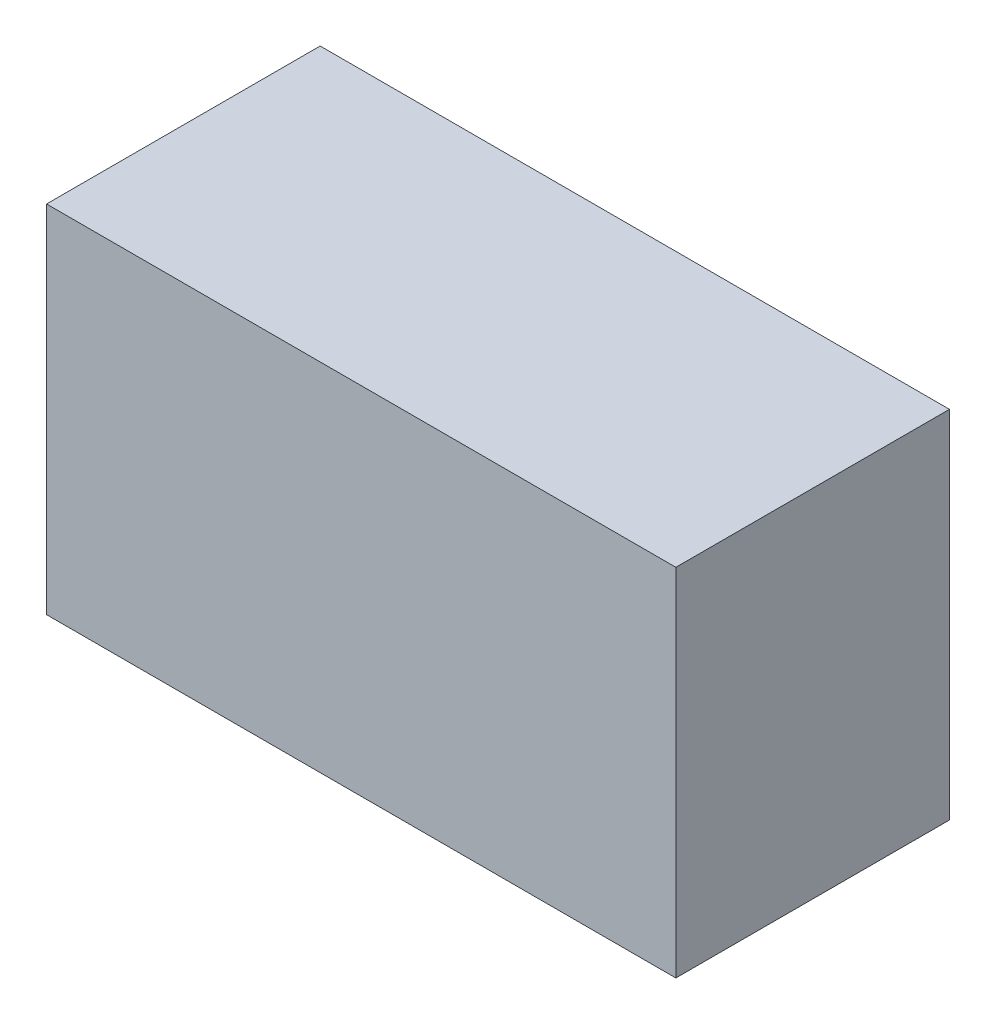
ISO-10303-21;
HEADER;
FILE_DESCRIPTION(('STEP AP214'),'2;1');
FILE_NAME('part.step','',(''),(''),'','','');
FILE_SCHEMA(('AUTOMOTIVE_DESIGN { 1 0 10303 214 1 1 1 1 }'));
ENDSEC;
DATA;
#1=APPLICATION_CONTEXT('core data for automotive mechanical design processes');
#2=APPLICATION_PROTOCOL_DEFINITION('international standard','automotive_design',2000,#1);
#3=PRODUCT_CONTEXT('',#1,'mechanical');
#4=PRODUCT('Part','Part','',(#3));
#5=PRODUCT_RELATED_PRODUCT_CATEGORY('part','',(#4));
#6=PRODUCT_DEFINITION_FORMATION('','',#4);
#7=PRODUCT_DEFINITION_CONTEXT('part definition',#1,'design');
#8=PRODUCT_DEFINITION('design','',#6,#7);
#9=PRODUCT_DEFINITION_SHAPE('','',#8);
#10=(LENGTH_UNIT() NAMED_UNIT(*) SI_UNIT(.MILLI.,.METRE.));
#11=(NAMED_UNIT(*) PLANE_ANGLE_UNIT() SI_UNIT($,.RADIAN.));
#12=(NAMED_UNIT(*) SI_UNIT($,.STERADIAN.) SOLID_ANGLE_UNIT());
#13=UNCERTAINTY_MEASURE_WITH_UNIT(LENGTH_MEASURE(1.E-05),#10,'distance_accuracy_value','');
#14=(GEOMETRIC_REPRESENTATION_CONTEXT(3) GLOBAL_UNCERTAINTY_ASSIGNED_CONTEXT((#13)) GLOBAL_UNIT_ASSIGNED_CONTEXT((#10,
#11,#12)) REPRESENTATION_CONTEXT('',''));
#15=CARTESIAN_POINT('',(0.,0.,0.));
#16=DIRECTION('',(0.,0.,1.));
#17=DIRECTION('',(1.,0.,0.));
#18=AXIS2_PLACEMENT_3D('',#15,#16,#17);
#19=CARTESIAN_POINT('',(0.,0.,20.));
#20=DIRECTION('',(1.,0.,0.));
#21=DIRECTION('',(0.,0.,-1.));
#22=AXIS2_PLACEMENT_3D('',#19,#20,#21);
#23=PLANE('',#22);
#24=DIRECTION('',(0.,-1.,0.));
#25=VECTOR('',#24,1.);
#26=CARTESIAN_POINT('',(0.,0.,0.));
#27=LINE('',#26,#25);
#28=CARTESIAN_POINT('',(0.,26.,0.));
#29=VERTEX_POINT('',#28);
#30=CARTESIAN_POINT('',(0.,0.,0.));
#31=VERTEX_POINT('',#30);
#32=EDGE_CURVE('E104',#29,#31,#27,.T.);
#33=ORIENTED_EDGE('',*,*,#32,.T.);
#34=DIRECTION('',(0.,0.,-1.));
#35=VECTOR('',#34,1.);
#36=CARTESIAN_POINT('',(0.,0.,20.));
#37=LINE('',#36,#35);
#38=CARTESIAN_POINT('',(0.,0.,20.));
#39=VERTEX_POINT('',#38);
#40=EDGE_CURVE('E11',#39,#31,#37,.T.);
#41=ORIENTED_EDGE('',*,*,#40,.F.);
#42=DIRECTION('',(0.,-1.,0.));
#43=VECTOR('',#42,1.);
#44=CARTESIAN_POINT('',(0.,0.,20.));
#45=LINE('',#44,#43);
#46=CARTESIAN_POINT('',(0.,26.,20.));
#47=VERTEX_POINT('',#46);
#48=EDGE_CURVE('E92',#47,#39,#45,.T.);
#49=ORIENTED_EDGE('',*,*,#48,.F.);
#50=DIRECTION('',(0.,0.,-1.));
#51=VECTOR('',#50,1.);
#52=CARTESIAN_POINT('',(0.,26.,20.));
#53=LINE('',#52,#51);
#54=EDGE_CURVE('E100',#47,#29,#53,.T.);
#55=ORIENTED_EDGE('',*,*,#54,.T.);
#56=EDGE_LOOP('',(#33,#41,#49,#55));
#57=FACE_BOUND('',#56,.T.);
#58=ADVANCED_FACE('F41',(#57),#23,.F.);
#59=CARTESIAN_POINT('',(0.,0.,20.));
#60=DIRECTION('',(0.,1.,0.));
#61=DIRECTION('',(0.,0.,1.));
#62=AXIS2_PLACEMENT_3D('',#59,#60,#61);
#63=PLANE('',#62);
#64=DIRECTION('',(1.,0.,0.));
#65=VECTOR('',#64,1.);
#66=CARTESIAN_POINT('',(0.,0.,0.));
#67=LINE('',#66,#65);
#68=CARTESIAN_POINT('',(46.,0.,0.));
#69=VERTEX_POINT('',#68);
#70=EDGE_CURVE('E96',#31,#69,#67,.T.);
#71=ORIENTED_EDGE('',*,*,#70,.T.);
#72=DIRECTION('',(0.,0.,-1.));
#73=VECTOR('',#72,1.);
#74=CARTESIAN_POINT('',(46.,0.,20.));
#75=LINE('',#74,#73);
#76=CARTESIAN_POINT('',(46.,0.,20.));
#77=VERTEX_POINT('',#76);
#78=EDGE_CURVE('E49',#77,#69,#75,.T.);
#79=ORIENTED_EDGE('',*,*,#78,.F.);
#80=DIRECTION('',(1.,0.,0.));
#81=VECTOR('',#80,1.);
#82=CARTESIAN_POINT('',(0.,0.,20.));
#83=LINE('',#82,#81);
#84=EDGE_CURVE('E87',#39,#77,#83,.T.);
#85=ORIENTED_EDGE('',*,*,#84,.F.);
#86=ORIENTED_EDGE('',*,*,#40,.T.);
#87=EDGE_LOOP('',(#71,#79,#85,#86));
#88=FACE_BOUND('',#87,.T.);
#89=ADVANCED_FACE('F95',(#88),#63,.F.);
#90=CARTESIAN_POINT('',(46.,0.,20.));
#91=DIRECTION('',(-1.,0.,0.));
#92=DIRECTION('',(0.,0.,1.));
#93=AXIS2_PLACEMENT_3D('',#90,#91,#92);
#94=PLANE('',#93);
#95=DIRECTION('',(0.,1.,0.));
#96=VECTOR('',#95,1.);
#97=CARTESIAN_POINT('',(46.,0.,0.));
#98=LINE('',#97,#96);
#99=CARTESIAN_POINT('',(46.,26.,0.));
#100=VERTEX_POINT('',#99);
#101=EDGE_CURVE('E74',#69,#100,#98,.T.);
#102=ORIENTED_EDGE('',*,*,#101,.T.);
#103=DIRECTION('',(0.,0.,-1.));
#104=VECTOR('',#103,1.);
#105=CARTESIAN_POINT('',(46.,26.,20.));
#106=LINE('',#105,#104);
#107=CARTESIAN_POINT('',(46.,26.,20.));
#108=VERTEX_POINT('',#107);
#109=EDGE_CURVE('E97',#108,#100,#106,.T.);
#110=ORIENTED_EDGE('',*,*,#109,.F.);
#111=DIRECTION('',(0.,1.,0.));
#112=VECTOR('',#111,1.);
#113=CARTESIAN_POINT('',(46.,0.,20.));
#114=LINE('',#113,#112);
#115=EDGE_CURVE('E90',#77,#108,#114,.T.);
#116=ORIENTED_EDGE('',*,*,#115,.F.);
#117=ORIENTED_EDGE('',*,*,#78,.T.);
#118=EDGE_LOOP('',(#102,#110,#116,#117));
#119=FACE_BOUND('',#118,.T.);
#120=ADVANCED_FACE('F98',(#119),#94,.F.);
#121=CARTESIAN_POINT('',(0.,26.,20.));
#122=DIRECTION('',(0.,-1.,0.));
#123=DIRECTION('',(0.,0.,-1.));
#124=AXIS2_PLACEMENT_3D('',#121,#122,#123);
#125=PLANE('',#124);
#126=DIRECTION('',(-1.,0.,0.));
#127=VECTOR('',#126,1.);
#128=CARTESIAN_POINT('',(0.,26.,0.));
#129=LINE('',#128,#127);
#130=EDGE_CURVE('E80',#100,#29,#129,.T.);
#131=ORIENTED_EDGE('',*,*,#130,.T.);
#132=ORIENTED_EDGE('',*,*,#54,.F.);
#133=DIRECTION('',(-1.,0.,0.));
#134=VECTOR('',#133,1.);
#135=CARTESIAN_POINT('',(0.,26.,20.));
#136=LINE('',#135,#134);
#137=EDGE_CURVE('E57',#108,#47,#136,.T.);
#138=ORIENTED_EDGE('',*,*,#137,.F.);
#139=ORIENTED_EDGE('',*,*,#109,.T.);
#140=EDGE_LOOP('',(#131,#132,#138,#139));
#141=FACE_BOUND('',#140,.T.);
#142=ADVANCED_FACE('F111',(#141),#125,.F.);
#143=CARTESIAN_POINT('',(0.,0.,20.));
#144=DIRECTION('',(0.,0.,-1.));
#145=DIRECTION('',(-1.,0.,0.));
#146=AXIS2_PLACEMENT_3D('',#143,#144,#145);
#147=PLANE('',#146);
#148=ORIENTED_EDGE('',*,*,#48,.T.);
#149=ORIENTED_EDGE('',*,*,#84,.T.);
#150=ORIENTED_EDGE('',*,*,#115,.T.);
#151=ORIENTED_EDGE('',*,*,#137,.T.);
#152=EDGE_LOOP('',(#148,#149,#150,#151));
#153=FACE_BOUND('',#152,.T.);
#154=ADVANCED_FACE('F88',(#153),#147,.F.);
#155=CARTESIAN_POINT('',(0.,0.,0.));
#156=DIRECTION('',(0.,0.,-1.));
#157=DIRECTION('',(-1.,0.,0.));
#158=AXIS2_PLACEMENT_3D('',#155,#156,#157);
#159=PLANE('',#158);
#160=ORIENTED_EDGE('',*,*,#32,.F.);
#161=ORIENTED_EDGE('',*,*,#130,.F.);
#162=ORIENTED_EDGE('',*,*,#101,.F.);
#163=ORIENTED_EDGE('',*,*,#70,.F.);
#164=EDGE_LOOP('',(#160,#161,#162,#163));
#165=FACE_BOUND('',#164,.T.);
#166=ADVANCED_FACE('F114',(#165),#159,.T.);
#167=CLOSED_SHELL('',(#58,#89,#120,#142,#154,#166));
#168=MANIFOLD_SOLID_BREP('B2',#167);
#169=ADVANCED_BREP_SHAPE_REPRESENTATION('',(#18,#168),#14);
#170=SHAPE_DEFINITION_REPRESENTATION(#9,#169);
ENDSEC;
END-ISO-10303-21;
